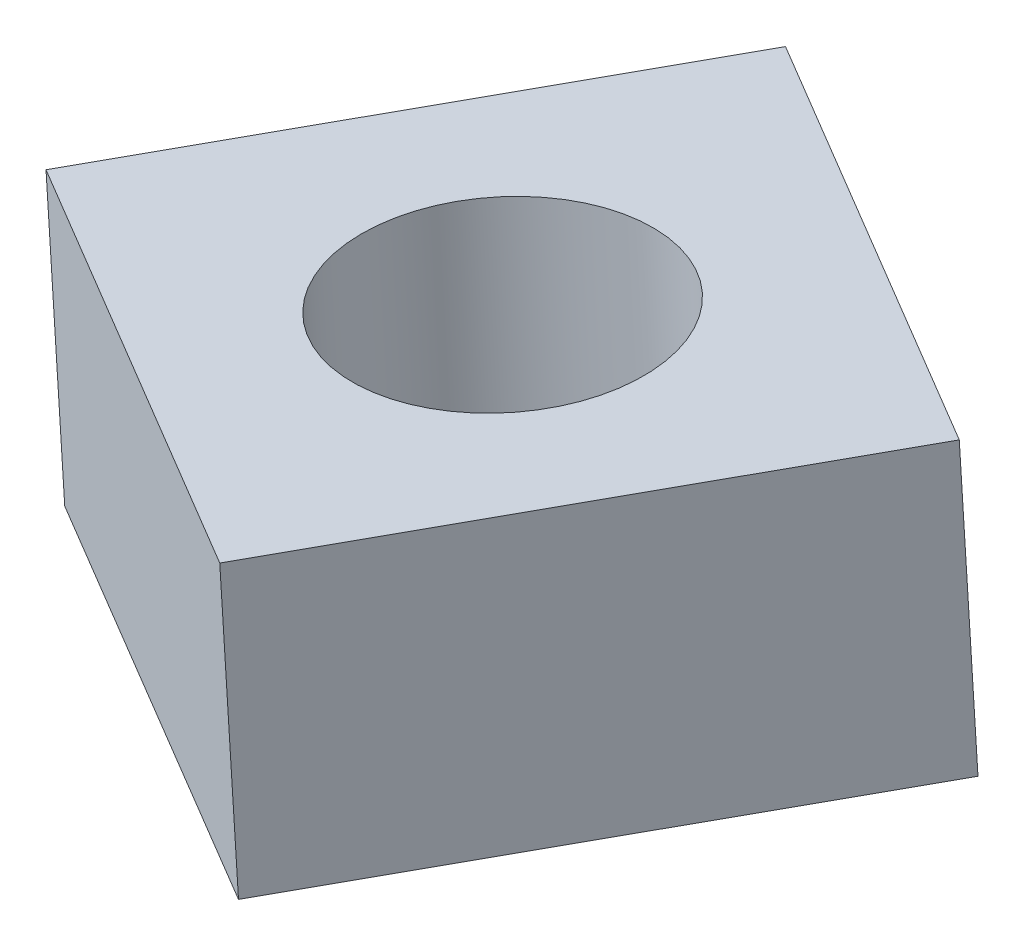
ISO-10303-21;
HEADER;
FILE_DESCRIPTION(('STEP AP214'),'2;1');
FILE_NAME('part.step','',(''),(''),'','','');
FILE_SCHEMA(('AUTOMOTIVE_DESIGN { 1 0 10303 214 1 1 1 1 }'));
ENDSEC;
DATA;
#1=APPLICATION_CONTEXT('core data for automotive mechanical design processes');
#2=APPLICATION_PROTOCOL_DEFINITION('international standard','automotive_design',2000,#1);
#3=PRODUCT_CONTEXT('',#1,'mechanical');
#4=PRODUCT('Part','Part','',(#3));
#5=PRODUCT_RELATED_PRODUCT_CATEGORY('part','',(#4));
#6=PRODUCT_DEFINITION_FORMATION('','',#4);
#7=PRODUCT_DEFINITION_CONTEXT('part definition',#1,'design');
#8=PRODUCT_DEFINITION('design','',#6,#7);
#9=PRODUCT_DEFINITION_SHAPE('','',#8);
#10=(LENGTH_UNIT() NAMED_UNIT(*) SI_UNIT(.MILLI.,.METRE.));
#11=(NAMED_UNIT(*) PLANE_ANGLE_UNIT() SI_UNIT($,.RADIAN.));
#12=(NAMED_UNIT(*) SI_UNIT($,.STERADIAN.) SOLID_ANGLE_UNIT());
#13=UNCERTAINTY_MEASURE_WITH_UNIT(LENGTH_MEASURE(1.E-05),#10,'distance_accuracy_value','');
#14=(GEOMETRIC_REPRESENTATION_CONTEXT(3) GLOBAL_UNCERTAINTY_ASSIGNED_CONTEXT((#13)) GLOBAL_UNIT_ASSIGNED_CONTEXT((#10,
#11,#12)) REPRESENTATION_CONTEXT('',''));
#15=CARTESIAN_POINT('',(0.,0.,0.));
#16=DIRECTION('',(0.,0.,1.));
#17=DIRECTION('',(1.,0.,0.));
#18=AXIS2_PLACEMENT_3D('',#15,#16,#17);
#19=CARTESIAN_POINT('',(1591.70887769014,522.978112772474,1085.26791361149));
#20=DIRECTION('',(-0.524590245887618,-0.0353485407806304,0.850620687841678));
#21=DIRECTION('',(0.851152619886389,0.,0.524918296176212));
#22=AXIS2_PLACEMENT_3D('',#19,#20,#21);
#23=PLANE('',#22);
#24=DIRECTION('',(-0.848907299609783,-0.0539888191188196,-0.525777142979212));
#25=VECTOR('',#24,1.);
#26=CARTESIAN_POINT('',(1592.03142499632,517.988534413231,1085.25948547948));
#27=LINE('',#26,#25);
#28=CARTESIAN_POINT('',(1592.03142499632,517.988534413231,1085.25948547948));
#29=VERTEX_POINT('',#28);
#30=CARTESIAN_POINT('',(1583.96680565003,517.475640631602,1080.26460262118));
#31=VERTEX_POINT('',#30);
#32=EDGE_CURVE('E73',#29,#31,#27,.T.);
#33=ORIENTED_EDGE('',*,*,#32,.F.);
#34=DIRECTION('',(0.0645094612347291,-0.997915671825448,-0.00168562640251072));
#35=VECTOR('',#34,1.);
#36=CARTESIAN_POINT('',(1591.70887769014,522.978112772474,1085.26791361149));
#37=LINE('',#36,#35);
#38=CARTESIAN_POINT('',(1591.70887769014,522.978112772474,1085.26791361149));
#39=VERTEX_POINT('',#38);
#40=EDGE_CURVE('E11',#39,#29,#37,.T.);
#41=ORIENTED_EDGE('',*,*,#40,.F.);
#42=DIRECTION('',(-0.848907299609783,-0.0539888191188196,-0.525777142979212));
#43=VECTOR('',#42,1.);
#44=CARTESIAN_POINT('',(1591.70887769014,522.978112772474,1085.26791361149));
#45=LINE('',#44,#43);
#46=CARTESIAN_POINT('',(1583.64425834385,522.465218990846,1080.27303075319));
#47=VERTEX_POINT('',#46);
#48=EDGE_CURVE('E75',#39,#47,#45,.T.);
#49=ORIENTED_EDGE('',*,*,#48,.T.);
#50=DIRECTION('',(0.0645094612347291,-0.997915671825448,-0.00168562640251072));
#51=VECTOR('',#50,1.);
#52=CARTESIAN_POINT('',(1583.64425834385,522.465218990846,1080.27303075319));
#53=LINE('',#52,#51);
#54=EDGE_CURVE('E36',#47,#31,#53,.T.);
#55=ORIENTED_EDGE('',*,*,#54,.T.);
#56=EDGE_LOOP('',(#33,#41,#49,#55));
#57=FACE_BOUND('',#56,.T.);
#58=ADVANCED_FACE('F33',(#57),#23,.T.);
#59=CARTESIAN_POINT('',(1596.69248502608,523.31392390989,1077.18701707699));
#60=DIRECTION('',(0.848907299609789,0.053988819118814,0.525777142979201));
#61=DIRECTION('',(0.526545087847718,0.,-0.850147205172986));
#62=AXIS2_PLACEMENT_3D('',#59,#60,#61);
#63=PLANE('',#62);
#64=DIRECTION('',(-0.524590245887607,-0.0353485407806309,0.850620687841684));
#65=VECTOR('',#64,1.);
#66=CARTESIAN_POINT('',(1597.01503233226,518.324345550647,1077.17858894498));
#67=LINE('',#66,#65);
#68=CARTESIAN_POINT('',(1597.01503233226,518.324345550647,1077.17858894498));
#69=VERTEX_POINT('',#68);
#70=EDGE_CURVE('E90',#69,#29,#67,.T.);
#71=ORIENTED_EDGE('',*,*,#70,.F.);
#72=DIRECTION('',(0.0645094612347291,-0.997915671825448,-0.00168562640251072));
#73=VECTOR('',#72,1.);
#74=CARTESIAN_POINT('',(1596.69248502608,523.31392390989,1077.18701707699));
#75=LINE('',#74,#73);
#76=CARTESIAN_POINT('',(1596.69248502608,523.31392390989,1077.18701707699));
#77=VERTEX_POINT('',#76);
#78=EDGE_CURVE('E41',#77,#69,#75,.T.);
#79=ORIENTED_EDGE('',*,*,#78,.F.);
#80=DIRECTION('',(-0.524590245887607,-0.0353485407806309,0.850620687841684));
#81=VECTOR('',#80,1.);
#82=CARTESIAN_POINT('',(1596.69248502608,523.31392390989,1077.18701707699));
#83=LINE('',#82,#81);
#84=EDGE_CURVE('E80',#77,#39,#83,.T.);
#85=ORIENTED_EDGE('',*,*,#84,.T.);
#86=ORIENTED_EDGE('',*,*,#40,.T.);
#87=EDGE_LOOP('',(#71,#79,#85,#86));
#88=FACE_BOUND('',#87,.T.);
#89=ADVANCED_FACE('F110',(#88),#63,.T.);
#90=CARTESIAN_POINT('',(1588.62786567978,522.801030128262,1072.19213421869));
#91=DIRECTION('',(0.524590245887618,0.0353485407806304,-0.850620687841678));
#92=DIRECTION('',(-0.851152619886389,0.,-0.524918296176212));
#93=AXIS2_PLACEMENT_3D('',#90,#91,#92);
#94=PLANE('',#93);
#95=DIRECTION('',(0.848907299609783,0.0539888191188196,0.525777142979212));
#96=VECTOR('',#95,1.);
#97=CARTESIAN_POINT('',(1588.95041298596,517.811451769018,1072.18370608668));
#98=LINE('',#97,#96);
#99=CARTESIAN_POINT('',(1588.95041298596,517.811451769018,1072.18370608668));
#100=VERTEX_POINT('',#99);
#101=EDGE_CURVE('E87',#100,#69,#98,.T.);
#102=ORIENTED_EDGE('',*,*,#101,.F.);
#103=DIRECTION('',(0.0645094612347291,-0.997915671825448,-0.00168562640251072));
#104=VECTOR('',#103,1.);
#105=CARTESIAN_POINT('',(1588.62786567978,522.801030128262,1072.19213421869));
#106=LINE('',#105,#104);
#107=CARTESIAN_POINT('',(1588.62786567978,522.801030128262,1072.19213421869));
#108=VERTEX_POINT('',#107);
#109=EDGE_CURVE('E79',#108,#100,#106,.T.);
#110=ORIENTED_EDGE('',*,*,#109,.F.);
#111=DIRECTION('',(0.848907299609783,0.0539888191188196,0.525777142979212));
#112=VECTOR('',#111,1.);
#113=CARTESIAN_POINT('',(1588.62786567978,522.801030128262,1072.19213421869));
#114=LINE('',#113,#112);
#115=EDGE_CURVE('E103',#108,#77,#114,.T.);
#116=ORIENTED_EDGE('',*,*,#115,.T.);
#117=ORIENTED_EDGE('',*,*,#78,.T.);
#118=EDGE_LOOP('',(#102,#110,#116,#117));
#119=FACE_BOUND('',#118,.T.);
#120=ADVANCED_FACE('F107',(#119),#94,.T.);
#121=CARTESIAN_POINT('',(1583.64425834385,522.465218990846,1080.27303075319));
#122=DIRECTION('',(-0.848907299609789,-0.053988819118814,-0.525777142979201));
#123=DIRECTION('',(-0.526545087847718,0.,0.850147205172986));
#124=AXIS2_PLACEMENT_3D('',#121,#122,#123);
#125=PLANE('',#124);
#126=DIRECTION('',(0.524590245887607,0.0353485407806309,-0.850620687841684));
#127=VECTOR('',#126,1.);
#128=CARTESIAN_POINT('',(1583.96680565003,517.475640631602,1080.26460262118));
#129=LINE('',#128,#127);
#130=EDGE_CURVE('E82',#31,#100,#129,.T.);
#131=ORIENTED_EDGE('',*,*,#130,.F.);
#132=ORIENTED_EDGE('',*,*,#54,.F.);
#133=DIRECTION('',(0.524590245887607,0.0353485407806309,-0.850620687841684));
#134=VECTOR('',#133,1.);
#135=CARTESIAN_POINT('',(1583.64425834385,522.465218990846,1080.27303075319));
#136=LINE('',#135,#134);
#137=EDGE_CURVE('E101',#47,#108,#136,.T.);
#138=ORIENTED_EDGE('',*,*,#137,.T.);
#139=ORIENTED_EDGE('',*,*,#109,.T.);
#140=EDGE_LOOP('',(#131,#132,#138,#139));
#141=FACE_BOUND('',#140,.T.);
#142=ADVANCED_FACE('F83',(#141),#125,.T.);
#143=CARTESIAN_POINT('',(1583.64425834385,522.465218990846,1080.27303075319));
#144=DIRECTION('',(0.0645094612347349,-0.997915671825448,-0.00168562640250847));
#145=DIRECTION('',(0.997917089535515,0.0645095528814693,0.));
#146=AXIS2_PLACEMENT_3D('',#143,#144,#145);
#147=PLANE('',#146);
#148=CARTESIAN_POINT('',(1590.16837168496,522.889571450368,1078.73002391509));
#149=DIRECTION('',(0.0645094612347291,-0.997915671825448,-0.00168562640251072));
#150=DIRECTION('',(-0.997917089535515,-0.0645095528814636,0.));
#151=AXIS2_PLACEMENT_3D('',#148,#149,#150);
#152=CIRCLE('',#151,2.50000000000001);
#153=CARTESIAN_POINT('',(1587.67357896112,522.728297568164,1078.73002391509));
#154=VERTEX_POINT('',#153);
#155=EDGE_CURVE('E91',#154,#154,#152,.T.);
#156=ORIENTED_EDGE('',*,*,#155,.T.);
#157=EDGE_LOOP('',(#156));
#158=FACE_BOUND('',#157,.T.);
#159=ORIENTED_EDGE('',*,*,#48,.F.);
#160=ORIENTED_EDGE('',*,*,#84,.F.);
#161=ORIENTED_EDGE('',*,*,#115,.F.);
#162=ORIENTED_EDGE('',*,*,#137,.F.);
#163=EDGE_LOOP('',(#159,#160,#161,#162));
#164=FACE_BOUND('',#163,.T.);
#165=ADVANCED_FACE('F112',(#158,#164),#147,.F.);
#166=CARTESIAN_POINT('',(1583.96680565003,517.475640631602,1080.26460262118));
#167=DIRECTION('',(0.0645094612347349,-0.997915671825448,-0.00168562640250847));
#168=DIRECTION('',(0.997917089535515,0.0645095528814693,0.));
#169=AXIS2_PLACEMENT_3D('',#166,#167,#168);
#170=PLANE('',#169);
#171=CARTESIAN_POINT('',(1590.49091899114,517.899993091125,1078.72159578308));
#172=DIRECTION('',(0.0645094612347291,-0.997915671825448,-0.00168562640251072));
#173=DIRECTION('',(-0.997917089535515,-0.0645095528814636,0.));
#174=AXIS2_PLACEMENT_3D('',#171,#172,#173);
#175=CIRCLE('',#174,2.50000000000001);
#176=CARTESIAN_POINT('',(1587.99612626731,517.738719208921,1078.72159578308));
#177=VERTEX_POINT('',#176);
#178=EDGE_CURVE('E94',#177,#177,#175,.T.);
#179=ORIENTED_EDGE('',*,*,#178,.F.);
#180=EDGE_LOOP('',(#179));
#181=FACE_BOUND('',#180,.T.);
#182=ORIENTED_EDGE('',*,*,#32,.T.);
#183=ORIENTED_EDGE('',*,*,#130,.T.);
#184=ORIENTED_EDGE('',*,*,#101,.T.);
#185=ORIENTED_EDGE('',*,*,#70,.T.);
#186=EDGE_LOOP('',(#182,#183,#184,#185));
#187=FACE_BOUND('',#186,.T.);
#188=ADVANCED_FACE('F89',(#181,#187),#170,.T.);
#189=CARTESIAN_POINT('',(1590.16837168496,522.889571450368,1078.73002391509));
#190=DIRECTION('',(0.0645094612347291,-0.997915671825448,-0.00168562640251072));
#191=DIRECTION('',(0.997917089535515,0.0645095528814636,0.));
#192=AXIS2_PLACEMENT_3D('',#189,#190,#191);
#193=CYLINDRICAL_SURFACE('',#192,2.50000000000001);
#194=ORIENTED_EDGE('',*,*,#155,.F.);
#195=EDGE_LOOP('',(#194));
#196=FACE_BOUND('',#195,.T.);
#197=ORIENTED_EDGE('',*,*,#178,.T.);
#198=EDGE_LOOP('',(#197));
#199=FACE_BOUND('',#198,.T.);
#200=ADVANCED_FACE('F120',(#196,#199),#193,.F.);
#201=CLOSED_SHELL('',(#58,#89,#120,#142,#165,#188,#200));
#202=MANIFOLD_SOLID_BREP('B2',#201);
#203=ADVANCED_BREP_SHAPE_REPRESENTATION('',(#18,#202),#14);
#204=SHAPE_DEFINITION_REPRESENTATION(#9,#203);
ENDSEC;
END-ISO-10303-21;
